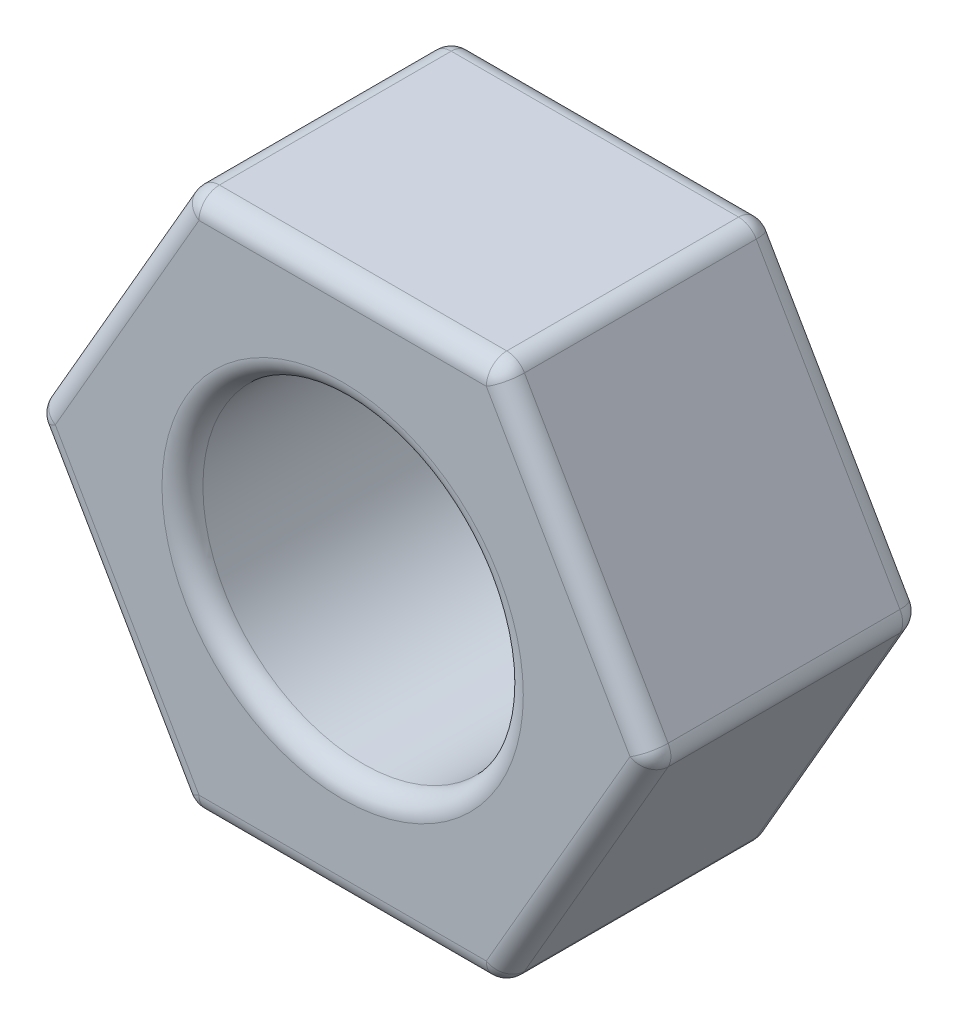
ISO-10303-21;
HEADER;
FILE_DESCRIPTION(('STEP AP214'),'2;1');
FILE_NAME('part.step','',(''),(''),'','','');
FILE_SCHEMA(('AUTOMOTIVE_DESIGN { 1 0 10303 214 1 1 1 1 }'));
ENDSEC;
DATA;
#1=APPLICATION_CONTEXT('core data for automotive mechanical design processes');
#2=APPLICATION_PROTOCOL_DEFINITION('international standard','automotive_design',2000,#1);
#3=PRODUCT_CONTEXT('',#1,'mechanical');
#4=PRODUCT('Part','Part','',(#3));
#5=PRODUCT_RELATED_PRODUCT_CATEGORY('part','',(#4));
#6=PRODUCT_DEFINITION_FORMATION('','',#4);
#7=PRODUCT_DEFINITION_CONTEXT('part definition',#1,'design');
#8=PRODUCT_DEFINITION('design','',#6,#7);
#9=PRODUCT_DEFINITION_SHAPE('','',#8);
#10=(LENGTH_UNIT() NAMED_UNIT(*) SI_UNIT(.MILLI.,.METRE.));
#11=(NAMED_UNIT(*) PLANE_ANGLE_UNIT() SI_UNIT($,.RADIAN.));
#12=(NAMED_UNIT(*) SI_UNIT($,.STERADIAN.) SOLID_ANGLE_UNIT());
#13=UNCERTAINTY_MEASURE_WITH_UNIT(LENGTH_MEASURE(1.E-05),#10,'distance_accuracy_value','');
#14=(GEOMETRIC_REPRESENTATION_CONTEXT(3) GLOBAL_UNCERTAINTY_ASSIGNED_CONTEXT((#13)) GLOBAL_UNIT_ASSIGNED_CONTEXT((#10,
#11,#12)) REPRESENTATION_CONTEXT('',''));
#15=CARTESIAN_POINT('',(0.,0.,0.));
#16=DIRECTION('',(0.,0.,1.));
#17=DIRECTION('',(1.,0.,0.));
#18=AXIS2_PLACEMENT_3D('',#15,#16,#17);
#19=CARTESIAN_POINT('',(0.,0.,4.));
#20=DIRECTION('',(0.,0.,1.));
#21=DIRECTION('',(1.,0.,0.));
#22=AXIS2_PLACEMENT_3D('',#19,#20,#21);
#23=PLANE('',#22);
#24=CARTESIAN_POINT('',(0.,0.,4.));
#25=DIRECTION('',(0.,0.,1.));
#26=DIRECTION('',(1.,0.,0.));
#27=AXIS2_PLACEMENT_3D('',#24,#25,#26);
#28=CIRCLE('',#27,2.65);
#29=CARTESIAN_POINT('',(2.65,0.,4.));
#30=VERTEX_POINT('',#29);
#31=EDGE_CURVE('E11',#30,#30,#28,.F.);
#32=ORIENTED_EDGE('',*,*,#31,.T.);
#33=EDGE_LOOP('',(#32));
#34=FACE_BOUND('',#33,.T.);
#35=DIRECTION('',(-0.5,0.866025403784439,0.));
#36=VECTOR('',#35,1.);
#37=CARTESIAN_POINT('',(2.02072594216369,3.8,4.));
#38=LINE('',#37,#36);
#39=CARTESIAN_POINT('',(4.21465696508427,0.,4.));
#40=VERTEX_POINT('',#39);
#41=CARTESIAN_POINT('',(2.10732848254213,3.65,4.));
#42=VERTEX_POINT('',#41);
#43=EDGE_CURVE('E60',#40,#42,#38,.T.);
#44=ORIENTED_EDGE('',*,*,#43,.T.);
#45=DIRECTION('',(-1.,0.,0.));
#46=VECTOR('',#45,1.);
#47=CARTESIAN_POINT('',(-2.28053356329902,3.65,4.));
#48=LINE('',#47,#46);
#49=CARTESIAN_POINT('',(-2.10732848254214,3.65,4.));
#50=VERTEX_POINT('',#49);
#51=EDGE_CURVE('E52',#42,#50,#48,.T.);
#52=ORIENTED_EDGE('',*,*,#51,.T.);
#53=DIRECTION('',(-0.5,-0.866025403784439,0.));
#54=VECTOR('',#53,1.);
#55=CARTESIAN_POINT('',(-4.30125950546271,-0.15,4.));
#56=LINE('',#55,#54);
#57=CARTESIAN_POINT('',(-4.21465696508427,0.,4.));
#58=VERTEX_POINT('',#57);
#59=EDGE_CURVE('E272',#50,#58,#56,.T.);
#60=ORIENTED_EDGE('',*,*,#59,.T.);
#61=DIRECTION('',(0.5,-0.866025403784439,0.));
#62=VECTOR('',#61,1.);
#63=CARTESIAN_POINT('',(-2.02072594216369,-3.8,4.));
#64=LINE('',#63,#62);
#65=CARTESIAN_POINT('',(-2.10732848254214,-3.65,4.));
#66=VERTEX_POINT('',#65);
#67=EDGE_CURVE('E274',#58,#66,#64,.T.);
#68=ORIENTED_EDGE('',*,*,#67,.T.);
#69=DIRECTION('',(1.,0.,0.));
#70=VECTOR('',#69,1.);
#71=CARTESIAN_POINT('',(2.28053356329902,-3.65,4.));
#72=LINE('',#71,#70);
#73=CARTESIAN_POINT('',(2.10732848254214,-3.65,4.));
#74=VERTEX_POINT('',#73);
#75=EDGE_CURVE('E276',#66,#74,#72,.T.);
#76=ORIENTED_EDGE('',*,*,#75,.T.);
#77=DIRECTION('',(0.5,0.866025403784439,0.));
#78=VECTOR('',#77,1.);
#79=CARTESIAN_POINT('',(4.30125950546271,0.15,4.));
#80=LINE('',#79,#78);
#81=EDGE_CURVE('E65',#74,#40,#80,.T.);
#82=ORIENTED_EDGE('',*,*,#81,.T.);
#83=EDGE_LOOP('',(#44,#52,#60,#68,#76,#82));
#84=FACE_BOUND('',#83,.T.);
#85=ADVANCED_FACE('F43',(#34,#84),#23,.T.);
#86=CARTESIAN_POINT('',(0.,0.,0.));
#87=DIRECTION('',(0.,0.,1.));
#88=DIRECTION('',(1.,0.,0.));
#89=AXIS2_PLACEMENT_3D('',#86,#87,#88);
#90=PLANE('',#89);
#91=CARTESIAN_POINT('',(0.,0.,0.));
#92=DIRECTION('',(0.,0.,1.));
#93=DIRECTION('',(1.,0.,0.));
#94=AXIS2_PLACEMENT_3D('',#91,#92,#93);
#95=CIRCLE('',#94,2.65);
#96=CARTESIAN_POINT('',(2.65,0.,0.));
#97=VERTEX_POINT('',#96);
#98=EDGE_CURVE('E206',#97,#97,#95,.T.);
#99=ORIENTED_EDGE('',*,*,#98,.T.);
#100=EDGE_LOOP('',(#99));
#101=FACE_BOUND('',#100,.T.);
#102=DIRECTION('',(0.5,-0.866025403784439,0.));
#103=VECTOR('',#102,1.);
#104=CARTESIAN_POINT('',(-3.1609927238132,-1.825,0.));
#105=LINE('',#104,#103);
#106=CARTESIAN_POINT('',(-2.10732848254213,-3.65,0.));
#107=VERTEX_POINT('',#106);
#108=CARTESIAN_POINT('',(-4.21465696508427,0.,0.));
#109=VERTEX_POINT('',#108);
#110=EDGE_CURVE('E204',#107,#109,#105,.F.);
#111=ORIENTED_EDGE('',*,*,#110,.T.);
#112=DIRECTION('',(-0.5,-0.866025403784439,0.));
#113=VECTOR('',#112,1.);
#114=CARTESIAN_POINT('',(-3.1609927238132,1.825,0.));
#115=LINE('',#114,#113);
#116=CARTESIAN_POINT('',(-2.10732848254214,3.65,0.));
#117=VERTEX_POINT('',#116);
#118=EDGE_CURVE('E175',#109,#117,#115,.F.);
#119=ORIENTED_EDGE('',*,*,#118,.T.);
#120=DIRECTION('',(-1.,0.,0.));
#121=VECTOR('',#120,1.);
#122=CARTESIAN_POINT('',(0.,3.65,0.));
#123=LINE('',#122,#121);
#124=CARTESIAN_POINT('',(2.10732848254213,3.65,0.));
#125=VERTEX_POINT('',#124);
#126=EDGE_CURVE('E194',#117,#125,#123,.F.);
#127=ORIENTED_EDGE('',*,*,#126,.T.);
#128=DIRECTION('',(-0.5,0.866025403784439,0.));
#129=VECTOR('',#128,1.);
#130=CARTESIAN_POINT('',(3.1609927238132,1.825,0.));
#131=LINE('',#130,#129);
#132=CARTESIAN_POINT('',(4.21465696508427,0.,0.));
#133=VERTEX_POINT('',#132);
#134=EDGE_CURVE('E200',#125,#133,#131,.F.);
#135=ORIENTED_EDGE('',*,*,#134,.T.);
#136=DIRECTION('',(0.5,0.866025403784439,0.));
#137=VECTOR('',#136,1.);
#138=CARTESIAN_POINT('',(3.1609927238132,-1.825,0.));
#139=LINE('',#138,#137);
#140=CARTESIAN_POINT('',(2.10732848254214,-3.65,0.));
#141=VERTEX_POINT('',#140);
#142=EDGE_CURVE('E450',#133,#141,#139,.F.);
#143=ORIENTED_EDGE('',*,*,#142,.T.);
#144=DIRECTION('',(1.,0.,0.));
#145=VECTOR('',#144,1.);
#146=CARTESIAN_POINT('',(0.,-3.65,0.));
#147=LINE('',#146,#145);
#148=EDGE_CURVE('E211',#141,#107,#147,.F.);
#149=ORIENTED_EDGE('',*,*,#148,.T.);
#150=EDGE_LOOP('',(#111,#119,#127,#135,#143,#149));
#151=FACE_BOUND('',#150,.T.);
#152=ADVANCED_FACE('F202',(#101,#151),#90,.F.);
#153=CARTESIAN_POINT('',(-2.28053356329902,3.95,4.));
#154=DIRECTION('',(0.866025403784439,-0.5,0.));
#155=DIRECTION('',(0.5,0.866025403784439,0.));
#156=AXIS2_PLACEMENT_3D('',#153,#154,#155);
#157=PLANE('',#156);
#158=DIRECTION('',(0.,0.,-1.));
#159=VECTOR('',#158,1.);
#160=CARTESIAN_POINT('',(-2.36713610367747,3.8,4.));
#161=LINE('',#160,#159);
#162=CARTESIAN_POINT('',(-2.36713610367747,3.8,3.7));
#163=VERTEX_POINT('',#162);
#164=CARTESIAN_POINT('',(-2.36713610367747,3.8,0.3));
#165=VERTEX_POINT('',#164);
#166=EDGE_CURVE('E222',#163,#165,#161,.T.);
#167=ORIENTED_EDGE('',*,*,#166,.T.);
#168=DIRECTION('',(-0.5,-0.866025403784439,0.));
#169=VECTOR('',#168,1.);
#170=CARTESIAN_POINT('',(-2.28053356329902,3.95,0.3));
#171=LINE('',#170,#169);
#172=CARTESIAN_POINT('',(-4.4744645862196,0.149999999999999,0.3));
#173=VERTEX_POINT('',#172);
#174=EDGE_CURVE('E178',#165,#173,#171,.T.);
#175=ORIENTED_EDGE('',*,*,#174,.T.);
#176=DIRECTION('',(0.,0.,-1.));
#177=VECTOR('',#176,1.);
#178=CARTESIAN_POINT('',(-4.4744645862196,0.149999999999999,4.));
#179=LINE('',#178,#177);
#180=CARTESIAN_POINT('',(-4.4744645862196,0.149999999999999,3.7));
#181=VERTEX_POINT('',#180);
#182=EDGE_CURVE('E224',#173,#181,#179,.F.);
#183=ORIENTED_EDGE('',*,*,#182,.T.);
#184=DIRECTION('',(-0.5,-0.866025403784439,0.));
#185=VECTOR('',#184,1.);
#186=CARTESIAN_POINT('',(-2.28053356329902,3.95,3.7));
#187=LINE('',#186,#185);
#188=EDGE_CURVE('E220',#181,#163,#187,.F.);
#189=ORIENTED_EDGE('',*,*,#188,.T.);
#190=EDGE_LOOP('',(#167,#175,#183,#189));
#191=FACE_BOUND('',#190,.T.);
#192=ADVANCED_FACE('F472',(#191),#157,.F.);
#193=CARTESIAN_POINT('',(-4.56106712659804,0.,4.));
#194=DIRECTION('',(0.866025403784439,0.5,0.));
#195=DIRECTION('',(-0.5,0.866025403784439,0.));
#196=AXIS2_PLACEMENT_3D('',#193,#194,#195);
#197=PLANE('',#196);
#198=DIRECTION('',(0.5,-0.866025403784439,0.));
#199=VECTOR('',#198,1.);
#200=CARTESIAN_POINT('',(-4.56106712659804,0.,3.7));
#201=LINE('',#200,#199);
#202=CARTESIAN_POINT('',(-2.36713610367747,-3.8,3.7));
#203=VERTEX_POINT('',#202);
#204=CARTESIAN_POINT('',(-4.4744645862196,-0.150000000000001,3.7));
#205=VERTEX_POINT('',#204);
#206=EDGE_CURVE('E227',#203,#205,#201,.F.);
#207=ORIENTED_EDGE('',*,*,#206,.T.);
#208=DIRECTION('',(0.,0.,-1.));
#209=VECTOR('',#208,1.);
#210=CARTESIAN_POINT('',(-4.4744645862196,-0.150000000000001,4.));
#211=LINE('',#210,#209);
#212=CARTESIAN_POINT('',(-4.4744645862196,-0.150000000000001,0.3));
#213=VERTEX_POINT('',#212);
#214=EDGE_CURVE('E233',#205,#213,#211,.T.);
#215=ORIENTED_EDGE('',*,*,#214,.T.);
#216=DIRECTION('',(0.5,-0.866025403784439,0.));
#217=VECTOR('',#216,1.);
#218=CARTESIAN_POINT('',(-4.56106712659804,0.,0.3));
#219=LINE('',#218,#217);
#220=CARTESIAN_POINT('',(-2.36713610367747,-3.8,0.3));
#221=VERTEX_POINT('',#220);
#222=EDGE_CURVE('E231',#213,#221,#219,.T.);
#223=ORIENTED_EDGE('',*,*,#222,.T.);
#224=DIRECTION('',(0.,0.,-1.));
#225=VECTOR('',#224,1.);
#226=CARTESIAN_POINT('',(-2.36713610367747,-3.8,4.));
#227=LINE('',#226,#225);
#228=EDGE_CURVE('E229',#221,#203,#227,.F.);
#229=ORIENTED_EDGE('',*,*,#228,.T.);
#230=EDGE_LOOP('',(#207,#215,#223,#229));
#231=FACE_BOUND('',#230,.T.);
#232=ADVANCED_FACE('F422',(#231),#197,.F.);
#233=CARTESIAN_POINT('',(-2.28053356329902,-3.95,4.));
#234=DIRECTION('',(0.,1.,0.));
#235=DIRECTION('',(0.,0.,1.));
#236=AXIS2_PLACEMENT_3D('',#233,#234,#235);
#237=PLANE('',#236);
#238=DIRECTION('',(1.,0.,0.));
#239=VECTOR('',#238,1.);
#240=CARTESIAN_POINT('',(-2.28053356329902,-3.95,3.7));
#241=LINE('',#240,#239);
#242=CARTESIAN_POINT('',(2.10732848254214,-3.95,3.7));
#243=VERTEX_POINT('',#242);
#244=CARTESIAN_POINT('',(-2.10732848254213,-3.95,3.7));
#245=VERTEX_POINT('',#244);
#246=EDGE_CURVE('E236',#243,#245,#241,.F.);
#247=ORIENTED_EDGE('',*,*,#246,.T.);
#248=DIRECTION('',(0.,0.,-1.));
#249=VECTOR('',#248,1.);
#250=CARTESIAN_POINT('',(-2.10732848254213,-3.95,4.));
#251=LINE('',#250,#249);
#252=CARTESIAN_POINT('',(-2.10732848254213,-3.95,0.3));
#253=VERTEX_POINT('',#252);
#254=EDGE_CURVE('E242',#245,#253,#251,.T.);
#255=ORIENTED_EDGE('',*,*,#254,.T.);
#256=DIRECTION('',(1.,0.,0.));
#257=VECTOR('',#256,1.);
#258=CARTESIAN_POINT('',(-2.28053356329902,-3.95,0.3));
#259=LINE('',#258,#257);
#260=CARTESIAN_POINT('',(2.10732848254214,-3.95,0.3));
#261=VERTEX_POINT('',#260);
#262=EDGE_CURVE('E240',#253,#261,#259,.T.);
#263=ORIENTED_EDGE('',*,*,#262,.T.);
#264=DIRECTION('',(0.,0.,-1.));
#265=VECTOR('',#264,1.);
#266=CARTESIAN_POINT('',(2.10732848254214,-3.95,4.));
#267=LINE('',#266,#265);
#268=EDGE_CURVE('E238',#261,#243,#267,.F.);
#269=ORIENTED_EDGE('',*,*,#268,.T.);
#270=EDGE_LOOP('',(#247,#255,#263,#269));
#271=FACE_BOUND('',#270,.T.);
#272=ADVANCED_FACE('F479',(#271),#237,.F.);
#273=CARTESIAN_POINT('',(2.28053356329902,-3.95,4.));
#274=DIRECTION('',(-0.866025403784439,0.5,0.));
#275=DIRECTION('',(-0.5,-0.866025403784439,0.));
#276=AXIS2_PLACEMENT_3D('',#273,#274,#275);
#277=PLANE('',#276);
#278=DIRECTION('',(0.5,0.866025403784439,0.));
#279=VECTOR('',#278,1.);
#280=CARTESIAN_POINT('',(2.28053356329902,-3.95,3.7));
#281=LINE('',#280,#279);
#282=CARTESIAN_POINT('',(4.4744645862196,-0.15,3.7));
#283=VERTEX_POINT('',#282);
#284=CARTESIAN_POINT('',(2.36713610367747,-3.8,3.7));
#285=VERTEX_POINT('',#284);
#286=EDGE_CURVE('E245',#283,#285,#281,.F.);
#287=ORIENTED_EDGE('',*,*,#286,.T.);
#288=DIRECTION('',(0.,0.,-1.));
#289=VECTOR('',#288,1.);
#290=CARTESIAN_POINT('',(2.36713610367747,-3.8,4.));
#291=LINE('',#290,#289);
#292=CARTESIAN_POINT('',(2.36713610367747,-3.8,0.3));
#293=VERTEX_POINT('',#292);
#294=EDGE_CURVE('E251',#285,#293,#291,.T.);
#295=ORIENTED_EDGE('',*,*,#294,.T.);
#296=DIRECTION('',(0.5,0.866025403784439,0.));
#297=VECTOR('',#296,1.);
#298=CARTESIAN_POINT('',(2.28053356329902,-3.95,0.3));
#299=LINE('',#298,#297);
#300=CARTESIAN_POINT('',(4.4744645862196,-0.15,0.3));
#301=VERTEX_POINT('',#300);
#302=EDGE_CURVE('E249',#293,#301,#299,.T.);
#303=ORIENTED_EDGE('',*,*,#302,.T.);
#304=DIRECTION('',(0.,0.,-1.));
#305=VECTOR('',#304,1.);
#306=CARTESIAN_POINT('',(4.4744645862196,-0.15,4.));
#307=LINE('',#306,#305);
#308=EDGE_CURVE('E247',#301,#283,#307,.F.);
#309=ORIENTED_EDGE('',*,*,#308,.T.);
#310=EDGE_LOOP('',(#287,#295,#303,#309));
#311=FACE_BOUND('',#310,.T.);
#312=ADVANCED_FACE('F444',(#311),#277,.F.);
#313=CARTESIAN_POINT('',(4.56106712659804,0.,4.));
#314=DIRECTION('',(-0.866025403784439,-0.5,0.));
#315=DIRECTION('',(0.5,-0.866025403784439,0.));
#316=AXIS2_PLACEMENT_3D('',#313,#314,#315);
#317=PLANE('',#316);
#318=DIRECTION('',(-0.5,0.866025403784439,0.));
#319=VECTOR('',#318,1.);
#320=CARTESIAN_POINT('',(4.56106712659804,0.,3.7));
#321=LINE('',#320,#319);
#322=CARTESIAN_POINT('',(2.36713610367747,3.8,3.7));
#323=VERTEX_POINT('',#322);
#324=CARTESIAN_POINT('',(4.4744645862196,0.15,3.7));
#325=VERTEX_POINT('',#324);
#326=EDGE_CURVE('E254',#323,#325,#321,.F.);
#327=ORIENTED_EDGE('',*,*,#326,.T.);
#328=DIRECTION('',(0.,0.,-1.));
#329=VECTOR('',#328,1.);
#330=CARTESIAN_POINT('',(4.4744645862196,0.15,4.));
#331=LINE('',#330,#329);
#332=CARTESIAN_POINT('',(4.4744645862196,0.15,0.3));
#333=VERTEX_POINT('',#332);
#334=EDGE_CURVE('E260',#325,#333,#331,.T.);
#335=ORIENTED_EDGE('',*,*,#334,.T.);
#336=DIRECTION('',(-0.5,0.866025403784439,0.));
#337=VECTOR('',#336,1.);
#338=CARTESIAN_POINT('',(4.56106712659804,0.,0.3));
#339=LINE('',#338,#337);
#340=CARTESIAN_POINT('',(2.36713610367747,3.8,0.3));
#341=VERTEX_POINT('',#340);
#342=EDGE_CURVE('E258',#333,#341,#339,.T.);
#343=ORIENTED_EDGE('',*,*,#342,.T.);
#344=DIRECTION('',(0.,0.,-1.));
#345=VECTOR('',#344,1.);
#346=CARTESIAN_POINT('',(2.36713610367747,3.8,4.));
#347=LINE('',#346,#345);
#348=EDGE_CURVE('E256',#341,#323,#347,.F.);
#349=ORIENTED_EDGE('',*,*,#348,.T.);
#350=EDGE_LOOP('',(#327,#335,#343,#349));
#351=FACE_BOUND('',#350,.T.);
#352=ADVANCED_FACE('F384',(#351),#317,.F.);
#353=CARTESIAN_POINT('',(2.28053356329902,3.95,4.));
#354=DIRECTION('',(0.,-1.,0.));
#355=DIRECTION('',(1.,0.,0.));
#356=AXIS2_PLACEMENT_3D('',#353,#354,#355);
#357=PLANE('',#356);
#358=DIRECTION('',(0.,0.,-1.));
#359=VECTOR('',#358,1.);
#360=CARTESIAN_POINT('',(2.10732848254213,3.95,4.));
#361=LINE('',#360,#359);
#362=CARTESIAN_POINT('',(2.10732848254213,3.95,3.7));
#363=VERTEX_POINT('',#362);
#364=CARTESIAN_POINT('',(2.10732848254213,3.95,0.3));
#365=VERTEX_POINT('',#364);
#366=EDGE_CURVE('E267',#363,#365,#361,.T.);
#367=ORIENTED_EDGE('',*,*,#366,.T.);
#368=DIRECTION('',(-1.,0.,0.));
#369=VECTOR('',#368,1.);
#370=CARTESIAN_POINT('',(2.28053356329902,3.95,0.3));
#371=LINE('',#370,#369);
#372=CARTESIAN_POINT('',(-2.10732848254214,3.95,0.3));
#373=VERTEX_POINT('',#372);
#374=EDGE_CURVE('E270',#365,#373,#371,.T.);
#375=ORIENTED_EDGE('',*,*,#374,.T.);
#376=DIRECTION('',(0.,0.,-1.));
#377=VECTOR('',#376,1.);
#378=CARTESIAN_POINT('',(-2.10732848254214,3.95,4.));
#379=LINE('',#378,#377);
#380=CARTESIAN_POINT('',(-2.10732848254214,3.95,3.7));
#381=VERTEX_POINT('',#380);
#382=EDGE_CURVE('E265',#373,#381,#379,.F.);
#383=ORIENTED_EDGE('',*,*,#382,.T.);
#384=DIRECTION('',(-1.,0.,0.));
#385=VECTOR('',#384,1.);
#386=CARTESIAN_POINT('',(2.28053356329902,3.95,3.7));
#387=LINE('',#386,#385);
#388=EDGE_CURVE('E263',#381,#363,#387,.F.);
#389=ORIENTED_EDGE('',*,*,#388,.T.);
#390=EDGE_LOOP('',(#367,#375,#383,#389));
#391=FACE_BOUND('',#390,.T.);
#392=ADVANCED_FACE('F463',(#391),#357,.F.);
#393=CARTESIAN_POINT('',(0.,0.,4.));
#394=DIRECTION('',(0.,0.,-1.));
#395=DIRECTION('',(-1.,0.,0.));
#396=AXIS2_PLACEMENT_3D('',#393,#394,#395);
#397=CYLINDRICAL_SURFACE('',#396,2.35);
#398=CARTESIAN_POINT('',(0.,0.,0.3));
#399=DIRECTION('',(0.,0.,1.));
#400=DIRECTION('',(1.,0.,0.));
#401=AXIS2_PLACEMENT_3D('',#398,#399,#400);
#402=CIRCLE('',#401,2.35);
#403=CARTESIAN_POINT('',(2.35,0.,0.3));
#404=VERTEX_POINT('',#403);
#405=EDGE_CURVE('E217',#404,#404,#402,.F.);
#406=ORIENTED_EDGE('',*,*,#405,.T.);
#407=EDGE_LOOP('',(#406));
#408=FACE_BOUND('',#407,.T.);
#409=CARTESIAN_POINT('',(0.,0.,3.7));
#410=DIRECTION('',(0.,0.,1.));
#411=DIRECTION('',(1.,0.,0.));
#412=AXIS2_PLACEMENT_3D('',#409,#410,#411);
#413=CIRCLE('',#412,2.35);
#414=CARTESIAN_POINT('',(2.35,0.,3.7));
#415=VERTEX_POINT('',#414);
#416=EDGE_CURVE('E209',#415,#415,#413,.T.);
#417=ORIENTED_EDGE('',*,*,#416,.T.);
#418=EDGE_LOOP('',(#417));
#419=FACE_BOUND('',#418,.T.);
#420=ADVANCED_FACE('F490',(#408,#419),#397,.F.);
#421=CARTESIAN_POINT('',(0.,0.,0.3));
#422=DIRECTION('',(0.,0.,1.));
#423=DIRECTION('',(1.,0.,0.));
#424=AXIS2_PLACEMENT_3D('',#421,#422,#423);
#425=TOROIDAL_SURFACE('',#424,2.65,0.3);
#426=ORIENTED_EDGE('',*,*,#405,.F.);
#427=EDGE_LOOP('',(#426));
#428=FACE_BOUND('',#427,.T.);
#429=ORIENTED_EDGE('',*,*,#98,.F.);
#430=EDGE_LOOP('',(#429));
#431=FACE_BOUND('',#430,.T.);
#432=ADVANCED_FACE('F579',(#428,#431),#425,.T.);
#433=CARTESIAN_POINT('',(3.1609927238132,-1.825,3.7));
#434=DIRECTION('',(-0.5,-0.866025403784439,0.));
#435=DIRECTION('',(0.866025403784439,-0.5,0.));
#436=AXIS2_PLACEMENT_3D('',#433,#434,#435);
#437=CYLINDRICAL_SURFACE('',#436,0.3);
#438=CARTESIAN_POINT('',(4.21465696508427,0.,3.7));
#439=DIRECTION('',(0.5,0.866025403784439,0.));
#440=DIRECTION('',(-0.866025403784439,0.5,0.));
#441=AXIS2_PLACEMENT_3D('',#438,#439,#440);
#442=CIRCLE('',#441,0.3);
#443=EDGE_CURVE('E47',#40,#283,#442,.T.);
#444=ORIENTED_EDGE('',*,*,#443,.F.);
#445=ORIENTED_EDGE('',*,*,#81,.F.);
#446=CARTESIAN_POINT('',(2.10732848254214,-3.65,3.7));
#447=DIRECTION('',(-0.5,-0.866025403784439,0.));
#448=DIRECTION('',(0.866025403784439,-0.5,0.));
#449=AXIS2_PLACEMENT_3D('',#446,#447,#448);
#450=CIRCLE('',#449,0.3);
#451=EDGE_CURVE('E364',#285,#74,#450,.T.);
#452=ORIENTED_EDGE('',*,*,#451,.F.);
#453=ORIENTED_EDGE('',*,*,#286,.F.);
#454=EDGE_LOOP('',(#444,#445,#452,#453));
#455=FACE_BOUND('',#454,.T.);
#456=ADVANCED_FACE('F435',(#455),#437,.T.);
#457=CARTESIAN_POINT('',(4.21465696508427,0.,3.7));
#458=DIRECTION('',(0.,0.,1.));
#459=DIRECTION('',(0.,-1.,0.));
#460=AXIS2_PLACEMENT_3D('',#457,#458,#459);
#461=SPHERICAL_SURFACE('',#460,0.3);
#462=CARTESIAN_POINT('',(4.21465696508427,0.,3.7));
#463=DIRECTION('',(0.5,-0.866025403784439,0.));
#464=DIRECTION('',(0.866025403784439,0.5,0.));
#465=AXIS2_PLACEMENT_3D('',#462,#463,#464);
#466=CIRCLE('',#465,0.3);
#467=EDGE_CURVE('E359',#40,#325,#466,.F.);
#468=ORIENTED_EDGE('',*,*,#467,.F.);
#469=ORIENTED_EDGE('',*,*,#443,.T.);
#470=CARTESIAN_POINT('',(4.21465696508427,0.,3.7));
#471=DIRECTION('',(0.,0.,1.));
#472=DIRECTION('',(1.,0.,0.));
#473=AXIS2_PLACEMENT_3D('',#470,#471,#472);
#474=CIRCLE('',#473,0.3);
#475=EDGE_CURVE('E362',#325,#283,#474,.F.);
#476=ORIENTED_EDGE('',*,*,#475,.F.);
#477=EDGE_LOOP('',(#468,#469,#476));
#478=FACE_BOUND('',#477,.T.);
#479=ADVANCED_FACE('F374',(#478),#461,.T.);
#480=CARTESIAN_POINT('',(2.10732848254214,-3.65,3.7));
#481=DIRECTION('',(0.,0.,1.));
#482=DIRECTION('',(1.,0.,0.));
#483=AXIS2_PLACEMENT_3D('',#480,#481,#482);
#484=SPHERICAL_SURFACE('',#483,0.3);
#485=CARTESIAN_POINT('',(2.10732848254214,-3.65,3.7));
#486=DIRECTION('',(0.,0.,1.));
#487=DIRECTION('',(1.,0.,0.));
#488=AXIS2_PLACEMENT_3D('',#485,#486,#487);
#489=CIRCLE('',#488,0.3);
#490=EDGE_CURVE('E353',#285,#243,#489,.F.);
#491=ORIENTED_EDGE('',*,*,#490,.F.);
#492=ORIENTED_EDGE('',*,*,#451,.T.);
#493=CARTESIAN_POINT('',(2.10732848254214,-3.65,3.7));
#494=DIRECTION('',(1.,0.,0.));
#495=DIRECTION('',(0.,1.,0.));
#496=AXIS2_PLACEMENT_3D('',#493,#494,#495);
#497=CIRCLE('',#496,0.3);
#498=EDGE_CURVE('E356',#243,#74,#497,.F.);
#499=ORIENTED_EDGE('',*,*,#498,.F.);
#500=EDGE_LOOP('',(#491,#492,#499));
#501=FACE_BOUND('',#500,.T.);
#502=ADVANCED_FACE('F437',(#501),#484,.T.);
#503=CARTESIAN_POINT('',(4.21465696508427,0.,4.));
#504=DIRECTION('',(0.,0.,-1.));
#505=DIRECTION('',(-1.,0.,0.));
#506=AXIS2_PLACEMENT_3D('',#503,#504,#505);
#507=CYLINDRICAL_SURFACE('',#506,0.3);
#508=ORIENTED_EDGE('',*,*,#475,.T.);
#509=ORIENTED_EDGE('',*,*,#308,.F.);
#510=CARTESIAN_POINT('',(4.21465696508427,0.,0.3));
#511=DIRECTION('',(0.,0.,-1.));
#512=DIRECTION('',(-1.,0.,0.));
#513=AXIS2_PLACEMENT_3D('',#510,#511,#512);
#514=CIRCLE('',#513,0.3);
#515=EDGE_CURVE('E347',#333,#301,#514,.T.);
#516=ORIENTED_EDGE('',*,*,#515,.F.);
#517=ORIENTED_EDGE('',*,*,#334,.F.);
#518=EDGE_LOOP('',(#508,#509,#516,#517));
#519=FACE_BOUND('',#518,.T.);
#520=ADVANCED_FACE('F380',(#519),#507,.T.);
#521=CARTESIAN_POINT('',(3.1609927238132,1.825,3.7));
#522=DIRECTION('',(0.5,-0.866025403784439,0.));
#523=DIRECTION('',(0.866025403784439,0.5,0.));
#524=AXIS2_PLACEMENT_3D('',#521,#522,#523);
#525=CYLINDRICAL_SURFACE('',#524,0.3);
#526=ORIENTED_EDGE('',*,*,#467,.T.);
#527=ORIENTED_EDGE('',*,*,#326,.F.);
#528=CARTESIAN_POINT('',(2.10732848254213,3.65,3.7));
#529=DIRECTION('',(-0.5,0.866025403784439,0.));
#530=DIRECTION('',(-0.866025403784439,-0.5,0.));
#531=AXIS2_PLACEMENT_3D('',#528,#529,#530);
#532=CIRCLE('',#531,0.3);
#533=EDGE_CURVE('E344',#42,#323,#532,.T.);
#534=ORIENTED_EDGE('',*,*,#533,.F.);
#535=ORIENTED_EDGE('',*,*,#43,.F.);
#536=EDGE_LOOP('',(#526,#527,#534,#535));
#537=FACE_BOUND('',#536,.T.);
#538=ADVANCED_FACE('F388',(#537),#525,.T.);
#539=CARTESIAN_POINT('',(0.,-3.65,3.7));
#540=DIRECTION('',(-1.,0.,0.));
#541=DIRECTION('',(0.,0.,1.));
#542=AXIS2_PLACEMENT_3D('',#539,#540,#541);
#543=CYLINDRICAL_SURFACE('',#542,0.3);
#544=ORIENTED_EDGE('',*,*,#498,.T.);
#545=ORIENTED_EDGE('',*,*,#75,.F.);
#546=CARTESIAN_POINT('',(-2.10732848254213,-3.65,3.7));
#547=DIRECTION('',(-1.,0.,0.));
#548=DIRECTION('',(0.,0.,1.));
#549=AXIS2_PLACEMENT_3D('',#546,#547,#548);
#550=CIRCLE('',#549,0.3);
#551=EDGE_CURVE('E341',#245,#66,#550,.T.);
#552=ORIENTED_EDGE('',*,*,#551,.F.);
#553=ORIENTED_EDGE('',*,*,#246,.F.);
#554=EDGE_LOOP('',(#544,#545,#552,#553));
#555=FACE_BOUND('',#554,.T.);
#556=ADVANCED_FACE('F434',(#555),#543,.T.);
#557=CARTESIAN_POINT('',(2.10732848254214,-3.65,4.));
#558=DIRECTION('',(0.,0.,-1.));
#559=DIRECTION('',(-1.,0.,0.));
#560=AXIS2_PLACEMENT_3D('',#557,#558,#559);
#561=CYLINDRICAL_SURFACE('',#560,0.3);
#562=ORIENTED_EDGE('',*,*,#490,.T.);
#563=ORIENTED_EDGE('',*,*,#268,.F.);
#564=CARTESIAN_POINT('',(2.10732848254214,-3.65,0.3));
#565=DIRECTION('',(0.,0.,-1.));
#566=DIRECTION('',(-1.,0.,0.));
#567=AXIS2_PLACEMENT_3D('',#564,#565,#566);
#568=CIRCLE('',#567,0.3);
#569=EDGE_CURVE('E338',#293,#261,#568,.T.);
#570=ORIENTED_EDGE('',*,*,#569,.F.);
#571=ORIENTED_EDGE('',*,*,#294,.F.);
#572=EDGE_LOOP('',(#562,#563,#570,#571));
#573=FACE_BOUND('',#572,.T.);
#574=ADVANCED_FACE('F441',(#573),#561,.T.);
#575=CARTESIAN_POINT('',(2.02072594216369,-3.8,0.3));
#576=DIRECTION('',(0.5,0.866025403784439,0.));
#577=DIRECTION('',(-0.866025403784439,0.5,0.));
#578=AXIS2_PLACEMENT_3D('',#575,#576,#577);
#579=CYLINDRICAL_SURFACE('',#578,0.3);
#580=CARTESIAN_POINT('',(4.21465696508427,0.,0.3));
#581=DIRECTION('',(0.5,0.866025403784439,0.));
#582=DIRECTION('',(-0.866025403784439,0.5,0.));
#583=AXIS2_PLACEMENT_3D('',#580,#581,#582);
#584=CIRCLE('',#583,0.3);
#585=EDGE_CURVE('E350',#301,#133,#584,.T.);
#586=ORIENTED_EDGE('',*,*,#585,.F.);
#587=ORIENTED_EDGE('',*,*,#302,.F.);
#588=CARTESIAN_POINT('',(2.10732848254214,-3.65,0.3));
#589=DIRECTION('',(-0.5,-0.866025403784438,0.));
#590=DIRECTION('',(0.866025403784439,-0.5,0.));
#591=AXIS2_PLACEMENT_3D('',#588,#589,#590);
#592=CIRCLE('',#591,0.3);
#593=EDGE_CURVE('E336',#141,#293,#592,.T.);
#594=ORIENTED_EDGE('',*,*,#593,.F.);
#595=ORIENTED_EDGE('',*,*,#142,.F.);
#596=EDGE_LOOP('',(#586,#587,#594,#595));
#597=FACE_BOUND('',#596,.T.);
#598=ADVANCED_FACE('F447',(#597),#579,.T.);
#599=CARTESIAN_POINT('',(4.21465696508427,0.,0.3));
#600=DIRECTION('',(0.,0.,-1.));
#601=DIRECTION('',(0.,1.,0.));
#602=AXIS2_PLACEMENT_3D('',#599,#600,#601);
#603=SPHERICAL_SURFACE('',#602,0.3);
#604=ORIENTED_EDGE('',*,*,#515,.T.);
#605=ORIENTED_EDGE('',*,*,#585,.T.);
#606=CARTESIAN_POINT('',(4.21465696508427,0.,0.3));
#607=DIRECTION('',(0.5,-0.866025403784438,0.));
#608=DIRECTION('',(0.866025403784438,0.500000000000001,0.));
#609=AXIS2_PLACEMENT_3D('',#606,#607,#608);
#610=CIRCLE('',#609,0.3);
#611=EDGE_CURVE('E333',#333,#133,#610,.F.);
#612=ORIENTED_EDGE('',*,*,#611,.F.);
#613=EDGE_LOOP('',(#604,#605,#612));
#614=FACE_BOUND('',#613,.T.);
#615=ADVANCED_FACE('F453',(#614),#603,.T.);
#616=CARTESIAN_POINT('',(2.10732848254213,3.65,3.7));
#617=DIRECTION('',(0.,0.,1.));
#618=DIRECTION('',(1.,0.,0.));
#619=AXIS2_PLACEMENT_3D('',#616,#617,#618);
#620=SPHERICAL_SURFACE('',#619,0.3);
#621=CARTESIAN_POINT('',(2.10732848254213,3.65,3.7));
#622=DIRECTION('',(1.,0.,0.));
#623=DIRECTION('',(0.,0.,-1.));
#624=AXIS2_PLACEMENT_3D('',#621,#622,#623);
#625=CIRCLE('',#624,0.3);
#626=EDGE_CURVE('E327',#42,#363,#625,.F.);
#627=ORIENTED_EDGE('',*,*,#626,.F.);
#628=ORIENTED_EDGE('',*,*,#533,.T.);
#629=CARTESIAN_POINT('',(2.10732848254213,3.65,3.7));
#630=DIRECTION('',(0.,0.,1.));
#631=DIRECTION('',(1.,0.,0.));
#632=AXIS2_PLACEMENT_3D('',#629,#630,#631);
#633=CIRCLE('',#632,0.3);
#634=EDGE_CURVE('E330',#363,#323,#633,.F.);
#635=ORIENTED_EDGE('',*,*,#634,.F.);
#636=EDGE_LOOP('',(#627,#628,#635));
#637=FACE_BOUND('',#636,.T.);
#638=ADVANCED_FACE('F393',(#637),#620,.T.);
#639=CARTESIAN_POINT('',(-2.10732848254213,-3.65,3.7));
#640=DIRECTION('',(0.,0.,1.));
#641=DIRECTION('',(1.,0.,0.));
#642=AXIS2_PLACEMENT_3D('',#639,#640,#641);
#643=SPHERICAL_SURFACE('',#642,0.3);
#644=CARTESIAN_POINT('',(-2.10732848254213,-3.65,3.7));
#645=DIRECTION('',(0.,0.,1.));
#646=DIRECTION('',(1.,0.,0.));
#647=AXIS2_PLACEMENT_3D('',#644,#645,#646);
#648=CIRCLE('',#647,0.3);
#649=EDGE_CURVE('E321',#245,#203,#648,.F.);
#650=ORIENTED_EDGE('',*,*,#649,.F.);
#651=ORIENTED_EDGE('',*,*,#551,.T.);
#652=CARTESIAN_POINT('',(-2.10732848254214,-3.65,3.7));
#653=DIRECTION('',(0.500000000000002,-0.866025403784437,0.));
#654=DIRECTION('',(0.866025403784438,0.500000000000002,0.));
#655=AXIS2_PLACEMENT_3D('',#652,#653,#654);
#656=CIRCLE('',#655,0.3);
#657=EDGE_CURVE('E324',#203,#66,#656,.F.);
#658=ORIENTED_EDGE('',*,*,#657,.F.);
#659=EDGE_LOOP('',(#650,#651,#658));
#660=FACE_BOUND('',#659,.T.);
#661=ADVANCED_FACE('F430',(#660),#643,.T.);
#662=CARTESIAN_POINT('',(2.10732848254214,-3.65,0.3));
#663=DIRECTION('',(0.,0.,-1.));
#664=DIRECTION('',(-1.,0.,0.));
#665=AXIS2_PLACEMENT_3D('',#662,#663,#664);
#666=SPHERICAL_SURFACE('',#665,0.3);
#667=ORIENTED_EDGE('',*,*,#593,.T.);
#668=ORIENTED_EDGE('',*,*,#569,.T.);
#669=CARTESIAN_POINT('',(2.10732848254214,-3.65,0.3));
#670=DIRECTION('',(1.,0.,0.));
#671=DIRECTION('',(0.,0.,-1.));
#672=AXIS2_PLACEMENT_3D('',#669,#670,#671);
#673=CIRCLE('',#672,0.3);
#674=EDGE_CURVE('E318',#141,#261,#673,.F.);
#675=ORIENTED_EDGE('',*,*,#674,.F.);
#676=EDGE_LOOP('',(#667,#668,#675));
#677=FACE_BOUND('',#676,.T.);
#678=ADVANCED_FACE('F504',(#677),#666,.T.);
#679=CARTESIAN_POINT('',(4.30125950546271,-0.15,0.3));
#680=DIRECTION('',(-0.5,0.866025403784439,0.));
#681=DIRECTION('',(-0.866025403784439,-0.5,0.));
#682=AXIS2_PLACEMENT_3D('',#679,#680,#681);
#683=CYLINDRICAL_SURFACE('',#682,0.3);
#684=ORIENTED_EDGE('',*,*,#611,.T.);
#685=ORIENTED_EDGE('',*,*,#134,.F.);
#686=CARTESIAN_POINT('',(2.10732848254213,3.65,0.3));
#687=DIRECTION('',(-0.5,0.866025403784439,0.));
#688=DIRECTION('',(-0.866025403784439,-0.5,0.));
#689=AXIS2_PLACEMENT_3D('',#686,#687,#688);
#690=CIRCLE('',#689,0.3);
#691=EDGE_CURVE('E315',#341,#125,#690,.T.);
#692=ORIENTED_EDGE('',*,*,#691,.F.);
#693=ORIENTED_EDGE('',*,*,#342,.F.);
#694=EDGE_LOOP('',(#684,#685,#692,#693));
#695=FACE_BOUND('',#694,.T.);
#696=ADVANCED_FACE('F455',(#695),#683,.T.);
#697=CARTESIAN_POINT('',(2.10732848254213,3.65,4.));
#698=DIRECTION('',(0.,0.,-1.));
#699=DIRECTION('',(-1.,0.,0.));
#700=AXIS2_PLACEMENT_3D('',#697,#698,#699);
#701=CYLINDRICAL_SURFACE('',#700,0.3);
#702=ORIENTED_EDGE('',*,*,#634,.T.);
#703=ORIENTED_EDGE('',*,*,#348,.F.);
#704=CARTESIAN_POINT('',(2.10732848254213,3.65,0.3));
#705=DIRECTION('',(0.,0.,-1.));
#706=DIRECTION('',(-1.,0.,0.));
#707=AXIS2_PLACEMENT_3D('',#704,#705,#706);
#708=CIRCLE('',#707,0.3);
#709=EDGE_CURVE('E312',#365,#341,#708,.T.);
#710=ORIENTED_EDGE('',*,*,#709,.F.);
#711=ORIENTED_EDGE('',*,*,#366,.F.);
#712=EDGE_LOOP('',(#702,#703,#710,#711));
#713=FACE_BOUND('',#712,.T.);
#714=ADVANCED_FACE('F461',(#713),#701,.T.);
#715=CARTESIAN_POINT('',(0.,3.65,3.7));
#716=DIRECTION('',(1.,0.,0.));
#717=DIRECTION('',(0.,1.,0.));
#718=AXIS2_PLACEMENT_3D('',#715,#716,#717);
#719=CYLINDRICAL_SURFACE('',#718,0.3);
#720=ORIENTED_EDGE('',*,*,#626,.T.);
#721=ORIENTED_EDGE('',*,*,#388,.F.);
#722=CARTESIAN_POINT('',(-2.10732848254214,3.65,3.7));
#723=DIRECTION('',(-1.,0.,0.));
#724=DIRECTION('',(0.,-1.,0.));
#725=AXIS2_PLACEMENT_3D('',#722,#723,#724);
#726=CIRCLE('',#725,0.3);
#727=EDGE_CURVE('E309',#50,#381,#726,.T.);
#728=ORIENTED_EDGE('',*,*,#727,.F.);
#729=ORIENTED_EDGE('',*,*,#51,.F.);
#730=EDGE_LOOP('',(#720,#721,#728,#729));
#731=FACE_BOUND('',#730,.T.);
#732=ADVANCED_FACE('F398',(#731),#719,.T.);
#733=CARTESIAN_POINT('',(-3.1609927238132,1.825,3.7));
#734=DIRECTION('',(0.5,0.866025403784439,0.));
#735=DIRECTION('',(-0.866025403784439,0.5,0.));
#736=AXIS2_PLACEMENT_3D('',#733,#734,#735);
#737=CYLINDRICAL_SURFACE('',#736,0.3);
#738=CARTESIAN_POINT('',(-4.21465696508427,0.,3.7));
#739=DIRECTION('',(-0.500000000000003,-0.866025403784437,0.));
#740=DIRECTION('',(0.866025403784437,-0.500000000000003,0.));
#741=AXIS2_PLACEMENT_3D('',#738,#739,#740);
#742=CIRCLE('',#741,0.3);
#743=EDGE_CURVE('E304',#58,#181,#742,.T.);
#744=ORIENTED_EDGE('',*,*,#743,.F.);
#745=ORIENTED_EDGE('',*,*,#59,.F.);
#746=CARTESIAN_POINT('',(-2.10732848254214,3.65,3.7));
#747=DIRECTION('',(0.5,0.866025403784439,0.));
#748=DIRECTION('',(-0.866025403784439,0.5,0.));
#749=AXIS2_PLACEMENT_3D('',#746,#747,#748);
#750=CIRCLE('',#749,0.3);
#751=EDGE_CURVE('E307',#163,#50,#750,.T.);
#752=ORIENTED_EDGE('',*,*,#751,.F.);
#753=ORIENTED_EDGE('',*,*,#188,.F.);
#754=EDGE_LOOP('',(#744,#745,#752,#753));
#755=FACE_BOUND('',#754,.T.);
#756=ADVANCED_FACE('F412',(#755),#737,.T.);
#757=CARTESIAN_POINT('',(-3.1609927238132,-1.825,3.7));
#758=DIRECTION('',(-0.5,0.866025403784439,0.));
#759=DIRECTION('',(-0.866025403784439,-0.5,0.));
#760=AXIS2_PLACEMENT_3D('',#757,#758,#759);
#761=CYLINDRICAL_SURFACE('',#760,0.3);
#762=ORIENTED_EDGE('',*,*,#657,.T.);
#763=ORIENTED_EDGE('',*,*,#67,.F.);
#764=CARTESIAN_POINT('',(-4.21465696508427,0.,3.7));
#765=DIRECTION('',(-0.5,0.866025403784438,0.));
#766=DIRECTION('',(-0.866025403784438,-0.5,0.));
#767=AXIS2_PLACEMENT_3D('',#764,#765,#766);
#768=CIRCLE('',#767,0.3);
#769=EDGE_CURVE('E301',#205,#58,#768,.T.);
#770=ORIENTED_EDGE('',*,*,#769,.F.);
#771=ORIENTED_EDGE('',*,*,#206,.F.);
#772=EDGE_LOOP('',(#762,#763,#770,#771));
#773=FACE_BOUND('',#772,.T.);
#774=ADVANCED_FACE('F407',(#773),#761,.T.);
#775=CARTESIAN_POINT('',(-2.10732848254213,-3.65,4.));
#776=DIRECTION('',(0.,0.,-1.));
#777=DIRECTION('',(-1.,0.,0.));
#778=AXIS2_PLACEMENT_3D('',#775,#776,#777);
#779=CYLINDRICAL_SURFACE('',#778,0.3);
#780=ORIENTED_EDGE('',*,*,#649,.T.);
#781=ORIENTED_EDGE('',*,*,#228,.F.);
#782=CARTESIAN_POINT('',(-2.10732848254213,-3.65,0.3));
#783=DIRECTION('',(0.,0.,-1.));
#784=DIRECTION('',(-1.,0.,0.));
#785=AXIS2_PLACEMENT_3D('',#782,#783,#784);
#786=CIRCLE('',#785,0.3);
#787=EDGE_CURVE('E298',#253,#221,#786,.T.);
#788=ORIENTED_EDGE('',*,*,#787,.F.);
#789=ORIENTED_EDGE('',*,*,#254,.F.);
#790=EDGE_LOOP('',(#780,#781,#788,#789));
#791=FACE_BOUND('',#790,.T.);
#792=ADVANCED_FACE('F428',(#791),#779,.T.);
#793=CARTESIAN_POINT('',(-2.28053356329902,-3.65,0.3));
#794=DIRECTION('',(1.,0.,0.));
#795=DIRECTION('',(0.,0.,-1.));
#796=AXIS2_PLACEMENT_3D('',#793,#794,#795);
#797=CYLINDRICAL_SURFACE('',#796,0.3);
#798=ORIENTED_EDGE('',*,*,#674,.T.);
#799=ORIENTED_EDGE('',*,*,#262,.F.);
#800=CARTESIAN_POINT('',(-2.10732848254213,-3.65,0.3));
#801=DIRECTION('',(-1.,0.,0.));
#802=DIRECTION('',(0.,0.,1.));
#803=AXIS2_PLACEMENT_3D('',#800,#801,#802);
#804=CIRCLE('',#803,0.3);
#805=EDGE_CURVE('E296',#107,#253,#804,.T.);
#806=ORIENTED_EDGE('',*,*,#805,.F.);
#807=ORIENTED_EDGE('',*,*,#148,.F.);
#808=EDGE_LOOP('',(#798,#799,#806,#807));
#809=FACE_BOUND('',#808,.T.);
#810=ADVANCED_FACE('F507',(#809),#797,.T.);
#811=CARTESIAN_POINT('',(2.10732848254213,3.65,0.3));
#812=DIRECTION('',(0.,0.,-1.));
#813=DIRECTION('',(-1.,0.,0.));
#814=AXIS2_PLACEMENT_3D('',#811,#812,#813);
#815=SPHERICAL_SURFACE('',#814,0.3);
#816=ORIENTED_EDGE('',*,*,#709,.T.);
#817=ORIENTED_EDGE('',*,*,#691,.T.);
#818=CARTESIAN_POINT('',(2.10732848254213,3.65,0.3));
#819=DIRECTION('',(1.,0.,0.));
#820=DIRECTION('',(0.,0.,-1.));
#821=AXIS2_PLACEMENT_3D('',#818,#819,#820);
#822=CIRCLE('',#821,0.3);
#823=EDGE_CURVE('E197',#365,#125,#822,.F.);
#824=ORIENTED_EDGE('',*,*,#823,.F.);
#825=EDGE_LOOP('',(#816,#817,#824));
#826=FACE_BOUND('',#825,.T.);
#827=ADVANCED_FACE('F459',(#826),#815,.T.);
#828=CARTESIAN_POINT('',(-2.10732848254214,3.65,3.7));
#829=DIRECTION('',(0.,0.,1.));
#830=DIRECTION('',(1.,0.,0.));
#831=AXIS2_PLACEMENT_3D('',#828,#829,#830);
#832=SPHERICAL_SURFACE('',#831,0.3);
#833=ORIENTED_EDGE('',*,*,#751,.T.);
#834=ORIENTED_EDGE('',*,*,#727,.T.);
#835=CARTESIAN_POINT('',(-2.10732848254214,3.65,3.7));
#836=DIRECTION('',(0.,0.,1.));
#837=DIRECTION('',(1.,0.,0.));
#838=AXIS2_PLACEMENT_3D('',#835,#836,#837);
#839=CIRCLE('',#838,0.3);
#840=EDGE_CURVE('E292',#163,#381,#839,.F.);
#841=ORIENTED_EDGE('',*,*,#840,.F.);
#842=EDGE_LOOP('',(#833,#834,#841));
#843=FACE_BOUND('',#842,.T.);
#844=ADVANCED_FACE('F467',(#843),#832,.T.);
#845=CARTESIAN_POINT('',(-4.21465696508427,0.,3.7));
#846=DIRECTION('',(0.,0.,1.));
#847=DIRECTION('',(1.,0.,0.));
#848=AXIS2_PLACEMENT_3D('',#845,#846,#847);
#849=SPHERICAL_SURFACE('',#848,0.3);
#850=ORIENTED_EDGE('',*,*,#769,.T.);
#851=ORIENTED_EDGE('',*,*,#743,.T.);
#852=CARTESIAN_POINT('',(-4.21465696508427,0.,3.7));
#853=DIRECTION('',(0.,0.,1.));
#854=DIRECTION('',(1.,0.,0.));
#855=AXIS2_PLACEMENT_3D('',#852,#853,#854);
#856=CIRCLE('',#855,0.3);
#857=EDGE_CURVE('E289',#205,#181,#856,.F.);
#858=ORIENTED_EDGE('',*,*,#857,.F.);
#859=EDGE_LOOP('',(#850,#851,#858));
#860=FACE_BOUND('',#859,.T.);
#861=ADVANCED_FACE('F414',(#860),#849,.T.);
#862=CARTESIAN_POINT('',(-2.10732848254213,-3.65,0.3));
#863=DIRECTION('',(0.,0.,-1.));
#864=DIRECTION('',(-1.,0.,0.));
#865=AXIS2_PLACEMENT_3D('',#862,#863,#864);
#866=SPHERICAL_SURFACE('',#865,0.3);
#867=ORIENTED_EDGE('',*,*,#805,.T.);
#868=ORIENTED_EDGE('',*,*,#787,.T.);
#869=CARTESIAN_POINT('',(-2.10732848254213,-3.65,0.3));
#870=DIRECTION('',(0.5,-0.866025403784439,0.));
#871=DIRECTION('',(0.866025403784439,0.5,0.));
#872=AXIS2_PLACEMENT_3D('',#869,#870,#871);
#873=CIRCLE('',#872,0.3);
#874=EDGE_CURVE('E191',#107,#221,#873,.F.);
#875=ORIENTED_EDGE('',*,*,#874,.F.);
#876=EDGE_LOOP('',(#867,#868,#875));
#877=FACE_BOUND('',#876,.T.);
#878=ADVANCED_FACE('F513',(#877),#866,.T.);
#879=CARTESIAN_POINT('',(2.28053356329902,3.65,0.3));
#880=DIRECTION('',(-1.,0.,0.));
#881=DIRECTION('',(0.,-1.,0.));
#882=AXIS2_PLACEMENT_3D('',#879,#880,#881);
#883=CYLINDRICAL_SURFACE('',#882,0.3);
#884=ORIENTED_EDGE('',*,*,#823,.T.);
#885=ORIENTED_EDGE('',*,*,#126,.F.);
#886=CARTESIAN_POINT('',(-2.10732848254214,3.65,0.3));
#887=DIRECTION('',(-1.,0.,0.));
#888=DIRECTION('',(0.,0.,1.));
#889=AXIS2_PLACEMENT_3D('',#886,#887,#888);
#890=CIRCLE('',#889,0.3);
#891=EDGE_CURVE('E185',#373,#117,#890,.T.);
#892=ORIENTED_EDGE('',*,*,#891,.F.);
#893=ORIENTED_EDGE('',*,*,#374,.F.);
#894=EDGE_LOOP('',(#884,#885,#892,#893));
#895=FACE_BOUND('',#894,.T.);
#896=ADVANCED_FACE('F195',(#895),#883,.T.);
#897=CARTESIAN_POINT('',(-2.10732848254214,3.65,4.));
#898=DIRECTION('',(0.,0.,-1.));
#899=DIRECTION('',(-1.,0.,0.));
#900=AXIS2_PLACEMENT_3D('',#897,#898,#899);
#901=CYLINDRICAL_SURFACE('',#900,0.3);
#902=ORIENTED_EDGE('',*,*,#840,.T.);
#903=ORIENTED_EDGE('',*,*,#382,.F.);
#904=CARTESIAN_POINT('',(-2.10732848254214,3.65,0.3));
#905=DIRECTION('',(0.,0.,-1.));
#906=DIRECTION('',(-1.,0.,0.));
#907=AXIS2_PLACEMENT_3D('',#904,#905,#906);
#908=CIRCLE('',#907,0.3);
#909=EDGE_CURVE('E189',#165,#373,#908,.T.);
#910=ORIENTED_EDGE('',*,*,#909,.F.);
#911=ORIENTED_EDGE('',*,*,#166,.F.);
#912=EDGE_LOOP('',(#902,#903,#910,#911));
#913=FACE_BOUND('',#912,.T.);
#914=ADVANCED_FACE('F470',(#913),#901,.T.);
#915=CARTESIAN_POINT('',(-4.21465696508427,0.,4.));
#916=DIRECTION('',(0.,0.,-1.));
#917=DIRECTION('',(-1.,0.,0.));
#918=AXIS2_PLACEMENT_3D('',#915,#916,#917);
#919=CYLINDRICAL_SURFACE('',#918,0.3);
#920=ORIENTED_EDGE('',*,*,#857,.T.);
#921=ORIENTED_EDGE('',*,*,#182,.F.);
#922=CARTESIAN_POINT('',(-4.21465696508427,0.,0.3));
#923=DIRECTION('',(0.,0.,-1.));
#924=DIRECTION('',(-1.,0.,0.));
#925=AXIS2_PLACEMENT_3D('',#922,#923,#924);
#926=CIRCLE('',#925,0.3);
#927=EDGE_CURVE('E283',#213,#173,#926,.T.);
#928=ORIENTED_EDGE('',*,*,#927,.F.);
#929=ORIENTED_EDGE('',*,*,#214,.F.);
#930=EDGE_LOOP('',(#920,#921,#928,#929));
#931=FACE_BOUND('',#930,.T.);
#932=ADVANCED_FACE('F419',(#931),#919,.T.);
#933=CARTESIAN_POINT('',(-4.30125950546271,0.149999999999999,0.3));
#934=DIRECTION('',(0.5,-0.866025403784439,0.));
#935=DIRECTION('',(0.866025403784439,0.5,0.));
#936=AXIS2_PLACEMENT_3D('',#933,#934,#935);
#937=CYLINDRICAL_SURFACE('',#936,0.3);
#938=ORIENTED_EDGE('',*,*,#874,.T.);
#939=ORIENTED_EDGE('',*,*,#222,.F.);
#940=CARTESIAN_POINT('',(-4.21465696508427,0.,0.3));
#941=DIRECTION('',(-0.5,0.866025403784438,0.));
#942=DIRECTION('',(-0.866025403784439,-0.5,0.));
#943=AXIS2_PLACEMENT_3D('',#940,#941,#942);
#944=CIRCLE('',#943,0.3);
#945=EDGE_CURVE('E181',#109,#213,#944,.T.);
#946=ORIENTED_EDGE('',*,*,#945,.F.);
#947=ORIENTED_EDGE('',*,*,#110,.F.);
#948=EDGE_LOOP('',(#938,#939,#946,#947));
#949=FACE_BOUND('',#948,.T.);
#950=ADVANCED_FACE('F515',(#949),#937,.T.);
#951=CARTESIAN_POINT('',(-2.10732848254214,3.65,0.3));
#952=DIRECTION('',(0.,0.,-1.));
#953=DIRECTION('',(-1.,0.,0.));
#954=AXIS2_PLACEMENT_3D('',#951,#952,#953);
#955=SPHERICAL_SURFACE('',#954,0.3);
#956=ORIENTED_EDGE('',*,*,#909,.T.);
#957=ORIENTED_EDGE('',*,*,#891,.T.);
#958=CARTESIAN_POINT('',(-2.10732848254214,3.65,0.3));
#959=DIRECTION('',(0.5,0.866025403784438,0.));
#960=DIRECTION('',(-0.866025403784439,0.5,0.));
#961=AXIS2_PLACEMENT_3D('',#958,#959,#960);
#962=CIRCLE('',#961,0.3);
#963=EDGE_CURVE('E171',#165,#117,#962,.F.);
#964=ORIENTED_EDGE('',*,*,#963,.F.);
#965=EDGE_LOOP('',(#956,#957,#964));
#966=FACE_BOUND('',#965,.T.);
#967=ADVANCED_FACE('F187',(#966),#955,.T.);
#968=CARTESIAN_POINT('',(-4.21465696508427,0.,0.3));
#969=DIRECTION('',(0.,0.,-1.));
#970=DIRECTION('',(0.,1.,0.));
#971=AXIS2_PLACEMENT_3D('',#968,#969,#970);
#972=SPHERICAL_SURFACE('',#971,0.3);
#973=ORIENTED_EDGE('',*,*,#945,.T.);
#974=ORIENTED_EDGE('',*,*,#927,.T.);
#975=CARTESIAN_POINT('',(-4.21465696508427,0.,0.3));
#976=DIRECTION('',(-0.5,-0.866025403784439,0.));
#977=DIRECTION('',(0.866025403784439,-0.5,0.));
#978=AXIS2_PLACEMENT_3D('',#975,#976,#977);
#979=CIRCLE('',#978,0.3);
#980=EDGE_CURVE('E182',#109,#173,#979,.F.);
#981=ORIENTED_EDGE('',*,*,#980,.F.);
#982=EDGE_LOOP('',(#973,#974,#981));
#983=FACE_BOUND('',#982,.T.);
#984=ADVANCED_FACE('F517',(#983),#972,.T.);
#985=CARTESIAN_POINT('',(-2.02072594216369,3.8,0.3));
#986=DIRECTION('',(-0.5,-0.866025403784439,0.));
#987=DIRECTION('',(0.866025403784439,-0.5,0.));
#988=AXIS2_PLACEMENT_3D('',#985,#986,#987);
#989=CYLINDRICAL_SURFACE('',#988,0.3);
#990=ORIENTED_EDGE('',*,*,#963,.T.);
#991=ORIENTED_EDGE('',*,*,#118,.F.);
#992=ORIENTED_EDGE('',*,*,#980,.T.);
#993=ORIENTED_EDGE('',*,*,#174,.F.);
#994=EDGE_LOOP('',(#990,#991,#992,#993));
#995=FACE_BOUND('',#994,.T.);
#996=ADVANCED_FACE('F173',(#995),#989,.T.);
#997=CARTESIAN_POINT('',(0.,0.,3.7));
#998=DIRECTION('',(0.,0.,1.));
#999=DIRECTION('',(1.,0.,0.));
#1000=AXIS2_PLACEMENT_3D('',#997,#998,#999);
#1001=TOROIDAL_SURFACE('',#1000,2.65,0.3);
#1002=ORIENTED_EDGE('',*,*,#31,.F.);
#1003=EDGE_LOOP('',(#1002));
#1004=FACE_BOUND('',#1003,.T.);
#1005=ORIENTED_EDGE('',*,*,#416,.F.);
#1006=EDGE_LOOP('',(#1005));
#1007=FACE_BOUND('',#1006,.T.);
#1008=ADVANCED_FACE('F45',(#1004,#1007),#1001,.T.);
#1009=CLOSED_SHELL('',(#85,#152,#192,#232,#272,#312,#352,#392,#420,#432,#456,#479,#502,#520,
#538,#556,#574,#598,#615,#638,#661,#678,#696,#714,#732,#756,#774,#792,#810,#827,#844,#861,#878,
#896,#914,#932,#950,#967,#984,#996,#1008));
#1010=MANIFOLD_SOLID_BREP('B2',#1009);
#1011=ADVANCED_BREP_SHAPE_REPRESENTATION('',(#18,#1010),#14);
#1012=SHAPE_DEFINITION_REPRESENTATION(#9,#1011);
ENDSEC;
END-ISO-10303-21;
